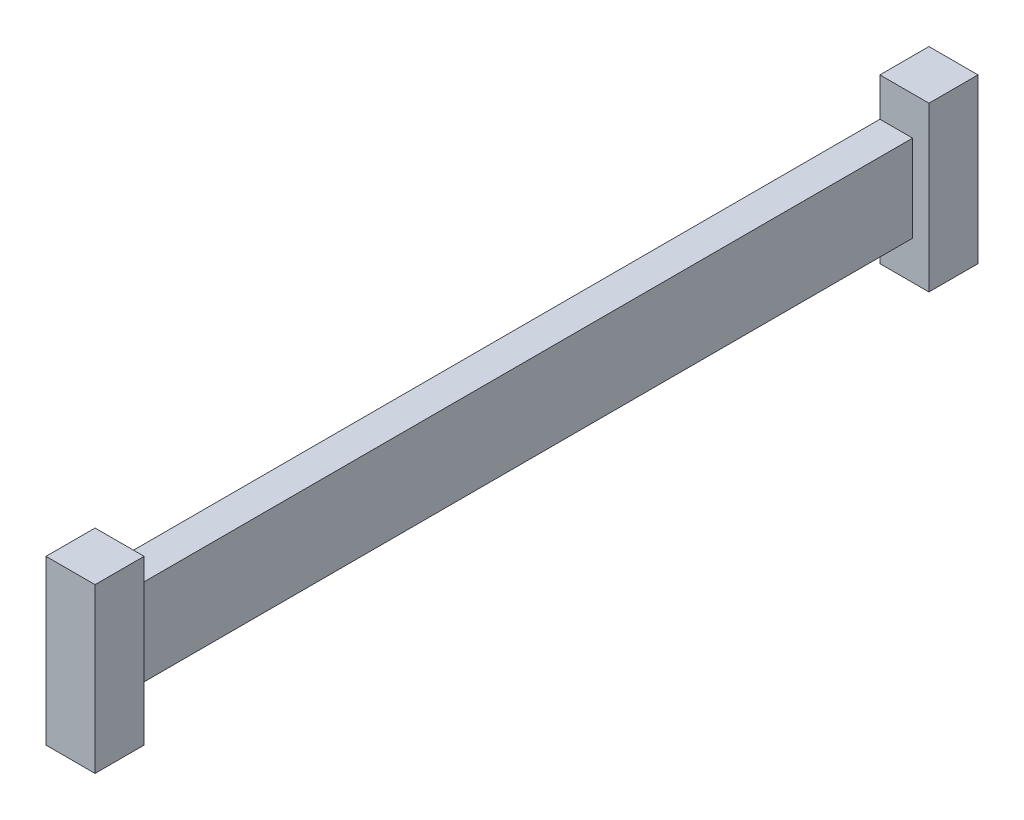
ISO-10303-21;
HEADER;
FILE_DESCRIPTION(('STEP AP214'),'2;1');
FILE_NAME('part.step','',(''),(''),'','','');
FILE_SCHEMA(('AUTOMOTIVE_DESIGN { 1 0 10303 214 1 1 1 1 }'));
ENDSEC;
DATA;
#1=APPLICATION_CONTEXT('core data for automotive mechanical design processes');
#2=APPLICATION_PROTOCOL_DEFINITION('international standard','automotive_design',2000,#1);
#3=PRODUCT_CONTEXT('',#1,'mechanical');
#4=PRODUCT('Part','Part','',(#3));
#5=PRODUCT_RELATED_PRODUCT_CATEGORY('part','',(#4));
#6=PRODUCT_DEFINITION_FORMATION('','',#4);
#7=PRODUCT_DEFINITION_CONTEXT('part definition',#1,'design');
#8=PRODUCT_DEFINITION('design','',#6,#7);
#9=PRODUCT_DEFINITION_SHAPE('','',#8);
#10=(LENGTH_UNIT() NAMED_UNIT(*) SI_UNIT(.MILLI.,.METRE.));
#11=(NAMED_UNIT(*) PLANE_ANGLE_UNIT() SI_UNIT($,.RADIAN.));
#12=(NAMED_UNIT(*) SI_UNIT($,.STERADIAN.) SOLID_ANGLE_UNIT());
#13=UNCERTAINTY_MEASURE_WITH_UNIT(LENGTH_MEASURE(1.E-05),#10,'distance_accuracy_value','');
#14=(GEOMETRIC_REPRESENTATION_CONTEXT(3) GLOBAL_UNCERTAINTY_ASSIGNED_CONTEXT((#13)) GLOBAL_UNIT_ASSIGNED_CONTEXT((#10,
#11,#12)) REPRESENTATION_CONTEXT('',''));
#15=CARTESIAN_POINT('',(0.,0.,0.));
#16=DIRECTION('',(0.,0.,1.));
#17=DIRECTION('',(1.,0.,0.));
#18=AXIS2_PLACEMENT_3D('',#15,#16,#17);
#19=CARTESIAN_POINT('',(3.,2.35,-51.));
#20=DIRECTION('',(0.,1.,0.));
#21=DIRECTION('',(0.,0.,1.));
#22=AXIS2_PLACEMENT_3D('',#19,#20,#21);
#23=PLANE('',#22);
#24=DIRECTION('',(0.,0.,-1.));
#25=VECTOR('',#24,1.);
#26=CARTESIAN_POINT('',(2.,2.35,-3.));
#27=LINE('',#26,#25);
#28=CARTESIAN_POINT('',(2.,2.35,-3.));
#29=VERTEX_POINT('',#28);
#30=CARTESIAN_POINT('',(2.,2.35,-51.));
#31=VERTEX_POINT('',#30);
#32=EDGE_CURVE('E198',#29,#31,#27,.T.);
#33=ORIENTED_EDGE('',*,*,#32,.F.);
#34=DIRECTION('',(-1.,0.,0.));
#35=VECTOR('',#34,1.);
#36=CARTESIAN_POINT('',(3.,2.35,-3.));
#37=LINE('',#36,#35);
#38=CARTESIAN_POINT('',(0.,2.35,-3.));
#39=VERTEX_POINT('',#38);
#40=EDGE_CURVE('E42',#29,#39,#37,.T.);
#41=ORIENTED_EDGE('',*,*,#40,.T.);
#42=DIRECTION('',(0.,0.,-1.));
#43=VECTOR('',#42,1.);
#44=CARTESIAN_POINT('',(0.,2.35,-51.));
#45=LINE('',#44,#43);
#46=CARTESIAN_POINT('',(0.,2.35,-51.));
#47=VERTEX_POINT('',#46);
#48=EDGE_CURVE('E152',#39,#47,#45,.T.);
#49=ORIENTED_EDGE('',*,*,#48,.T.);
#50=DIRECTION('',(-1.,0.,0.));
#51=VECTOR('',#50,1.);
#52=CARTESIAN_POINT('',(3.,2.35,-51.));
#53=LINE('',#52,#51);
#54=EDGE_CURVE('E189',#31,#47,#53,.T.);
#55=ORIENTED_EDGE('',*,*,#54,.F.);
#56=EDGE_LOOP('',(#33,#41,#49,#55));
#57=FACE_BOUND('',#56,.T.);
#58=ADVANCED_FACE('F33',(#57),#23,.F.);
#59=CARTESIAN_POINT('',(3.,7.65,-3.));
#60=DIRECTION('',(0.,-1.,0.));
#61=DIRECTION('',(0.,0.,-1.));
#62=AXIS2_PLACEMENT_3D('',#59,#60,#61);
#63=PLANE('',#62);
#64=DIRECTION('',(0.,0.,1.));
#65=VECTOR('',#64,1.);
#66=CARTESIAN_POINT('',(2.,7.65,-3.));
#67=LINE('',#66,#65);
#68=CARTESIAN_POINT('',(2.,7.65,-51.));
#69=VERTEX_POINT('',#68);
#70=CARTESIAN_POINT('',(2.,7.65,-3.));
#71=VERTEX_POINT('',#70);
#72=EDGE_CURVE('E149',#69,#71,#67,.T.);
#73=ORIENTED_EDGE('',*,*,#72,.F.);
#74=DIRECTION('',(-1.,0.,0.));
#75=VECTOR('',#74,1.);
#76=CARTESIAN_POINT('',(3.,7.65,-51.));
#77=LINE('',#76,#75);
#78=CARTESIAN_POINT('',(0.,7.65,-51.));
#79=VERTEX_POINT('',#78);
#80=EDGE_CURVE('E175',#69,#79,#77,.T.);
#81=ORIENTED_EDGE('',*,*,#80,.T.);
#82=DIRECTION('',(0.,0.,1.));
#83=VECTOR('',#82,1.);
#84=CARTESIAN_POINT('',(0.,7.65,-3.));
#85=LINE('',#84,#83);
#86=CARTESIAN_POINT('',(0.,7.65,-3.));
#87=VERTEX_POINT('',#86);
#88=EDGE_CURVE('E166',#79,#87,#85,.T.);
#89=ORIENTED_EDGE('',*,*,#88,.T.);
#90=DIRECTION('',(-1.,0.,0.));
#91=VECTOR('',#90,1.);
#92=CARTESIAN_POINT('',(3.,7.65,-3.));
#93=LINE('',#92,#91);
#94=EDGE_CURVE('E132',#71,#87,#93,.T.);
#95=ORIENTED_EDGE('',*,*,#94,.F.);
#96=EDGE_LOOP('',(#73,#81,#89,#95));
#97=FACE_BOUND('',#96,.T.);
#98=ADVANCED_FACE('F240',(#97),#63,.F.);
#99=CARTESIAN_POINT('',(3.,0.,0.));
#100=DIRECTION('',(-1.,0.,0.));
#101=DIRECTION('',(0.,0.,1.));
#102=AXIS2_PLACEMENT_3D('',#99,#100,#101);
#103=PLANE('',#102);
#104=DIRECTION('',(0.,1.,0.));
#105=VECTOR('',#104,1.);
#106=CARTESIAN_POINT('',(3.,2.35,-3.));
#107=LINE('',#106,#105);
#108=CARTESIAN_POINT('',(3.,0.,-3.));
#109=VERTEX_POINT('',#108);
#110=CARTESIAN_POINT('',(3.,10.,-3.));
#111=VERTEX_POINT('',#110);
#112=EDGE_CURVE('E106',#109,#111,#107,.T.);
#113=ORIENTED_EDGE('',*,*,#112,.T.);
#114=DIRECTION('',(0.,0.,1.));
#115=VECTOR('',#114,1.);
#116=CARTESIAN_POINT('',(3.,10.,0.));
#117=LINE('',#116,#115);
#118=CARTESIAN_POINT('',(3.,10.,0.));
#119=VERTEX_POINT('',#118);
#120=EDGE_CURVE('E122',#111,#119,#117,.T.);
#121=ORIENTED_EDGE('',*,*,#120,.T.);
#122=DIRECTION('',(0.,-1.,0.));
#123=VECTOR('',#122,1.);
#124=CARTESIAN_POINT('',(3.,0.,0.));
#125=LINE('',#124,#123);
#126=CARTESIAN_POINT('',(3.,0.,0.));
#127=VERTEX_POINT('',#126);
#128=EDGE_CURVE('E50',#119,#127,#125,.T.);
#129=ORIENTED_EDGE('',*,*,#128,.T.);
#130=DIRECTION('',(0.,0.,-1.));
#131=VECTOR('',#130,1.);
#132=CARTESIAN_POINT('',(3.,0.,-3.));
#133=LINE('',#132,#131);
#134=EDGE_CURVE('E124',#127,#109,#133,.T.);
#135=ORIENTED_EDGE('',*,*,#134,.T.);
#136=EDGE_LOOP('',(#113,#121,#129,#135));
#137=FACE_BOUND('',#136,.T.);
#138=ADVANCED_FACE('F120',(#137),#103,.F.);
#139=CARTESIAN_POINT('',(3.,0.,-3.));
#140=DIRECTION('',(0.,1.,0.));
#141=DIRECTION('',(0.,0.,1.));
#142=AXIS2_PLACEMENT_3D('',#139,#140,#141);
#143=PLANE('',#142);
#144=DIRECTION('',(0.,0.,-1.));
#145=VECTOR('',#144,1.);
#146=CARTESIAN_POINT('',(0.,0.,-3.));
#147=LINE('',#146,#145);
#148=CARTESIAN_POINT('',(0.,0.,0.));
#149=VERTEX_POINT('',#148);
#150=CARTESIAN_POINT('',(0.,0.,-3.));
#151=VERTEX_POINT('',#150);
#152=EDGE_CURVE('E145',#149,#151,#147,.T.);
#153=ORIENTED_EDGE('',*,*,#152,.T.);
#154=DIRECTION('',(-1.,0.,0.));
#155=VECTOR('',#154,1.);
#156=CARTESIAN_POINT('',(3.,0.,-3.));
#157=LINE('',#156,#155);
#158=EDGE_CURVE('E11',#109,#151,#157,.T.);
#159=ORIENTED_EDGE('',*,*,#158,.F.);
#160=ORIENTED_EDGE('',*,*,#134,.F.);
#161=DIRECTION('',(-1.,0.,0.));
#162=VECTOR('',#161,1.);
#163=CARTESIAN_POINT('',(3.,0.,0.));
#164=LINE('',#163,#162);
#165=EDGE_CURVE('E138',#127,#149,#164,.T.);
#166=ORIENTED_EDGE('',*,*,#165,.T.);
#167=EDGE_LOOP('',(#153,#159,#160,#166));
#168=FACE_BOUND('',#167,.T.);
#169=ADVANCED_FACE('F35',(#168),#143,.F.);
#170=CARTESIAN_POINT('',(3.,0.,-54.));
#171=DIRECTION('',(0.,1.,0.));
#172=DIRECTION('',(0.,0.,1.));
#173=AXIS2_PLACEMENT_3D('',#170,#171,#172);
#174=PLANE('',#173);
#175=DIRECTION('',(0.,0.,-1.));
#176=VECTOR('',#175,1.);
#177=CARTESIAN_POINT('',(0.,0.,-54.));
#178=LINE('',#177,#176);
#179=CARTESIAN_POINT('',(0.,0.,-51.));
#180=VERTEX_POINT('',#179);
#181=CARTESIAN_POINT('',(0.,0.,-54.));
#182=VERTEX_POINT('',#181);
#183=EDGE_CURVE('E157',#180,#182,#178,.T.);
#184=ORIENTED_EDGE('',*,*,#183,.T.);
#185=DIRECTION('',(-1.,0.,0.));
#186=VECTOR('',#185,1.);
#187=CARTESIAN_POINT('',(3.,0.,-54.));
#188=LINE('',#187,#186);
#189=CARTESIAN_POINT('',(3.,0.,-54.));
#190=VERTEX_POINT('',#189);
#191=EDGE_CURVE('E183',#190,#182,#188,.T.);
#192=ORIENTED_EDGE('',*,*,#191,.F.);
#193=DIRECTION('',(0.,0.,-1.));
#194=VECTOR('',#193,1.);
#195=CARTESIAN_POINT('',(3.,0.,-54.));
#196=LINE('',#195,#194);
#197=CARTESIAN_POINT('',(3.,0.,-51.));
#198=VERTEX_POINT('',#197);
#199=EDGE_CURVE('E213',#198,#190,#196,.T.);
#200=ORIENTED_EDGE('',*,*,#199,.F.);
#201=DIRECTION('',(-1.,0.,0.));
#202=VECTOR('',#201,1.);
#203=CARTESIAN_POINT('',(3.,0.,-51.));
#204=LINE('',#203,#202);
#205=EDGE_CURVE('E186',#198,#180,#204,.T.);
#206=ORIENTED_EDGE('',*,*,#205,.T.);
#207=EDGE_LOOP('',(#184,#192,#200,#206));
#208=FACE_BOUND('',#207,.T.);
#209=ADVANCED_FACE('F211',(#208),#174,.F.);
#210=CARTESIAN_POINT('',(3.,10.,-54.));
#211=DIRECTION('',(0.,0.,1.));
#212=DIRECTION('',(1.,0.,0.));
#213=AXIS2_PLACEMENT_3D('',#210,#211,#212);
#214=PLANE('',#213);
#215=DIRECTION('',(0.,1.,0.));
#216=VECTOR('',#215,1.);
#217=CARTESIAN_POINT('',(0.,10.,-54.));
#218=LINE('',#217,#216);
#219=CARTESIAN_POINT('',(0.,10.,-54.));
#220=VERTEX_POINT('',#219);
#221=EDGE_CURVE('E159',#182,#220,#218,.T.);
#222=ORIENTED_EDGE('',*,*,#221,.T.);
#223=DIRECTION('',(-1.,0.,0.));
#224=VECTOR('',#223,1.);
#225=CARTESIAN_POINT('',(3.,10.,-54.));
#226=LINE('',#225,#224);
#227=CARTESIAN_POINT('',(3.,10.,-54.));
#228=VERTEX_POINT('',#227);
#229=EDGE_CURVE('E180',#228,#220,#226,.T.);
#230=ORIENTED_EDGE('',*,*,#229,.F.);
#231=DIRECTION('',(0.,1.,0.));
#232=VECTOR('',#231,1.);
#233=CARTESIAN_POINT('',(3.,10.,-54.));
#234=LINE('',#233,#232);
#235=EDGE_CURVE('E141',#190,#228,#234,.T.);
#236=ORIENTED_EDGE('',*,*,#235,.F.);
#237=ORIENTED_EDGE('',*,*,#191,.T.);
#238=EDGE_LOOP('',(#222,#230,#236,#237));
#239=FACE_BOUND('',#238,.T.);
#240=ADVANCED_FACE('F261',(#239),#214,.F.);
#241=CARTESIAN_POINT('',(3.,10.,-51.));
#242=DIRECTION('',(0.,-1.,0.));
#243=DIRECTION('',(0.,0.,-1.));
#244=AXIS2_PLACEMENT_3D('',#241,#242,#243);
#245=PLANE('',#244);
#246=DIRECTION('',(0.,0.,1.));
#247=VECTOR('',#246,1.);
#248=CARTESIAN_POINT('',(0.,10.,-51.));
#249=LINE('',#248,#247);
#250=CARTESIAN_POINT('',(0.,10.,-51.));
#251=VERTEX_POINT('',#250);
#252=EDGE_CURVE('E161',#220,#251,#249,.T.);
#253=ORIENTED_EDGE('',*,*,#252,.T.);
#254=DIRECTION('',(-1.,0.,0.));
#255=VECTOR('',#254,1.);
#256=CARTESIAN_POINT('',(3.,10.,-51.));
#257=LINE('',#256,#255);
#258=CARTESIAN_POINT('',(3.,10.,-51.));
#259=VERTEX_POINT('',#258);
#260=EDGE_CURVE('E177',#259,#251,#257,.T.);
#261=ORIENTED_EDGE('',*,*,#260,.F.);
#262=DIRECTION('',(0.,0.,1.));
#263=VECTOR('',#262,1.);
#264=CARTESIAN_POINT('',(3.,10.,-51.));
#265=LINE('',#264,#263);
#266=EDGE_CURVE('E136',#228,#259,#265,.T.);
#267=ORIENTED_EDGE('',*,*,#266,.F.);
#268=ORIENTED_EDGE('',*,*,#229,.T.);
#269=EDGE_LOOP('',(#253,#261,#267,#268));
#270=FACE_BOUND('',#269,.T.);
#271=ADVANCED_FACE('F264',(#270),#245,.F.);
#272=CARTESIAN_POINT('',(3.,7.65,-51.));
#273=DIRECTION('',(0.,0.,-1.));
#274=DIRECTION('',(0.,1.,0.));
#275=AXIS2_PLACEMENT_3D('',#272,#273,#274);
#276=PLANE('',#275);
#277=DIRECTION('',(0.,-1.,0.));
#278=VECTOR('',#277,1.);
#279=CARTESIAN_POINT('',(0.,7.65,-51.));
#280=LINE('',#279,#278);
#281=EDGE_CURVE('E163',#251,#79,#280,.T.);
#282=ORIENTED_EDGE('',*,*,#281,.T.);
#283=ORIENTED_EDGE('',*,*,#80,.F.);
#284=DIRECTION('',(0.,1.,0.));
#285=VECTOR('',#284,1.);
#286=CARTESIAN_POINT('',(2.,7.65,-51.));
#287=LINE('',#286,#285);
#288=EDGE_CURVE('E222',#31,#69,#287,.T.);
#289=ORIENTED_EDGE('',*,*,#288,.F.);
#290=ORIENTED_EDGE('',*,*,#54,.T.);
#291=DIRECTION('',(0.,-1.,0.));
#292=VECTOR('',#291,1.);
#293=CARTESIAN_POINT('',(0.,0.,-51.));
#294=LINE('',#293,#292);
#295=EDGE_CURVE('E155',#47,#180,#294,.T.);
#296=ORIENTED_EDGE('',*,*,#295,.T.);
#297=ORIENTED_EDGE('',*,*,#205,.F.);
#298=DIRECTION('',(0.,-1.,0.));
#299=VECTOR('',#298,1.);
#300=CARTESIAN_POINT('',(3.,0.,-51.));
#301=LINE('',#300,#299);
#302=EDGE_CURVE('E126',#259,#198,#301,.T.);
#303=ORIENTED_EDGE('',*,*,#302,.F.);
#304=ORIENTED_EDGE('',*,*,#260,.T.);
#305=EDGE_LOOP('',(#282,#283,#289,#290,#296,#297,#303,#304));
#306=FACE_BOUND('',#305,.T.);
#307=ADVANCED_FACE('F207',(#306),#276,.F.);
#308=CARTESIAN_POINT('',(3.,10.,-3.));
#309=DIRECTION('',(0.,0.,1.));
#310=DIRECTION('',(0.,-1.,0.));
#311=AXIS2_PLACEMENT_3D('',#308,#309,#310);
#312=PLANE('',#311);
#313=DIRECTION('',(0.,1.,0.));
#314=VECTOR('',#313,1.);
#315=CARTESIAN_POINT('',(0.,10.,-3.));
#316=LINE('',#315,#314);
#317=CARTESIAN_POINT('',(0.,10.,-3.));
#318=VERTEX_POINT('',#317);
#319=EDGE_CURVE('E131',#87,#318,#316,.T.);
#320=ORIENTED_EDGE('',*,*,#319,.T.);
#321=DIRECTION('',(-1.,0.,0.));
#322=VECTOR('',#321,1.);
#323=CARTESIAN_POINT('',(3.,10.,-3.));
#324=LINE('',#323,#322);
#325=EDGE_CURVE('E128',#111,#318,#324,.T.);
#326=ORIENTED_EDGE('',*,*,#325,.F.);
#327=ORIENTED_EDGE('',*,*,#112,.F.);
#328=ORIENTED_EDGE('',*,*,#158,.T.);
#329=DIRECTION('',(0.,1.,0.));
#330=VECTOR('',#329,1.);
#331=CARTESIAN_POINT('',(0.,2.35,-3.));
#332=LINE('',#331,#330);
#333=EDGE_CURVE('E148',#151,#39,#332,.T.);
#334=ORIENTED_EDGE('',*,*,#333,.T.);
#335=ORIENTED_EDGE('',*,*,#40,.F.);
#336=DIRECTION('',(0.,-1.,0.));
#337=VECTOR('',#336,1.);
#338=CARTESIAN_POINT('',(2.,7.65,-3.));
#339=LINE('',#338,#337);
#340=EDGE_CURVE('E226',#71,#29,#339,.T.);
#341=ORIENTED_EDGE('',*,*,#340,.F.);
#342=ORIENTED_EDGE('',*,*,#94,.T.);
#343=EDGE_LOOP('',(#320,#326,#327,#328,#334,#335,#341,#342));
#344=FACE_BOUND('',#343,.T.);
#345=ADVANCED_FACE('F129',(#344),#312,.F.);
#346=CARTESIAN_POINT('',(3.,10.,0.));
#347=DIRECTION('',(0.,-1.,0.));
#348=DIRECTION('',(0.,0.,-1.));
#349=AXIS2_PLACEMENT_3D('',#346,#347,#348);
#350=PLANE('',#349);
#351=DIRECTION('',(0.,0.,1.));
#352=VECTOR('',#351,1.);
#353=CARTESIAN_POINT('',(0.,10.,0.));
#354=LINE('',#353,#352);
#355=CARTESIAN_POINT('',(0.,10.,0.));
#356=VERTEX_POINT('',#355);
#357=EDGE_CURVE('E92',#318,#356,#354,.T.);
#358=ORIENTED_EDGE('',*,*,#357,.T.);
#359=DIRECTION('',(-1.,0.,0.));
#360=VECTOR('',#359,1.);
#361=CARTESIAN_POINT('',(3.,10.,0.));
#362=LINE('',#361,#360);
#363=EDGE_CURVE('E133',#119,#356,#362,.T.);
#364=ORIENTED_EDGE('',*,*,#363,.F.);
#365=ORIENTED_EDGE('',*,*,#120,.F.);
#366=ORIENTED_EDGE('',*,*,#325,.T.);
#367=EDGE_LOOP('',(#358,#364,#365,#366));
#368=FACE_BOUND('',#367,.T.);
#369=ADVANCED_FACE('F135',(#368),#350,.F.);
#370=CARTESIAN_POINT('',(3.,0.,0.));
#371=DIRECTION('',(0.,0.,-1.));
#372=DIRECTION('',(-1.,0.,0.));
#373=AXIS2_PLACEMENT_3D('',#370,#371,#372);
#374=PLANE('',#373);
#375=DIRECTION('',(0.,-1.,0.));
#376=VECTOR('',#375,1.);
#377=CARTESIAN_POINT('',(0.,0.,0.));
#378=LINE('',#377,#376);
#379=EDGE_CURVE('E98',#356,#149,#378,.T.);
#380=ORIENTED_EDGE('',*,*,#379,.T.);
#381=ORIENTED_EDGE('',*,*,#165,.F.);
#382=ORIENTED_EDGE('',*,*,#128,.F.);
#383=ORIENTED_EDGE('',*,*,#363,.T.);
#384=EDGE_LOOP('',(#380,#381,#382,#383));
#385=FACE_BOUND('',#384,.T.);
#386=ADVANCED_FACE('F242',(#385),#374,.F.);
#387=ORIENTED_EDGE('',*,*,#266,.T.);
#388=ORIENTED_EDGE('',*,*,#302,.T.);
#389=ORIENTED_EDGE('',*,*,#199,.T.);
#390=ORIENTED_EDGE('',*,*,#235,.T.);
#391=EDGE_LOOP('',(#387,#388,#389,#390));
#392=FACE_BOUND('',#391,.T.);
#393=ADVANCED_FACE('F244',(#392),#103,.F.);
#394=CARTESIAN_POINT('',(0.,0.,0.));
#395=DIRECTION('',(-1.,0.,0.));
#396=DIRECTION('',(0.,0.,1.));
#397=AXIS2_PLACEMENT_3D('',#394,#395,#396);
#398=PLANE('',#397);
#399=ORIENTED_EDGE('',*,*,#152,.F.);
#400=ORIENTED_EDGE('',*,*,#379,.F.);
#401=ORIENTED_EDGE('',*,*,#357,.F.);
#402=ORIENTED_EDGE('',*,*,#319,.F.);
#403=ORIENTED_EDGE('',*,*,#88,.F.);
#404=ORIENTED_EDGE('',*,*,#281,.F.);
#405=ORIENTED_EDGE('',*,*,#252,.F.);
#406=ORIENTED_EDGE('',*,*,#221,.F.);
#407=ORIENTED_EDGE('',*,*,#183,.F.);
#408=ORIENTED_EDGE('',*,*,#295,.F.);
#409=ORIENTED_EDGE('',*,*,#48,.F.);
#410=ORIENTED_EDGE('',*,*,#333,.F.);
#411=EDGE_LOOP('',(#399,#400,#401,#402,#403,#404,#405,#406,#407,#408,#409,#410));
#412=FACE_BOUND('',#411,.T.);
#413=ADVANCED_FACE('F202',(#412),#398,.T.);
#414=CARTESIAN_POINT('',(2.,0.,0.));
#415=DIRECTION('',(1.,0.,0.));
#416=DIRECTION('',(0.,0.,-1.));
#417=AXIS2_PLACEMENT_3D('',#414,#415,#416);
#418=PLANE('',#417);
#419=ORIENTED_EDGE('',*,*,#340,.T.);
#420=ORIENTED_EDGE('',*,*,#32,.T.);
#421=ORIENTED_EDGE('',*,*,#288,.T.);
#422=ORIENTED_EDGE('',*,*,#72,.T.);
#423=EDGE_LOOP('',(#419,#420,#421,#422));
#424=FACE_BOUND('',#423,.T.);
#425=ADVANCED_FACE('F229',(#424),#418,.T.);
#426=CLOSED_SHELL('',(#58,#98,#138,#169,#209,#240,#271,#307,#345,#369,#386,#393,#413,#425));
#427=MANIFOLD_SOLID_BREP('B2',#426);
#428=ADVANCED_BREP_SHAPE_REPRESENTATION('',(#18,#427),#14);
#429=SHAPE_DEFINITION_REPRESENTATION(#9,#428);
ENDSEC;
END-ISO-10303-21;
